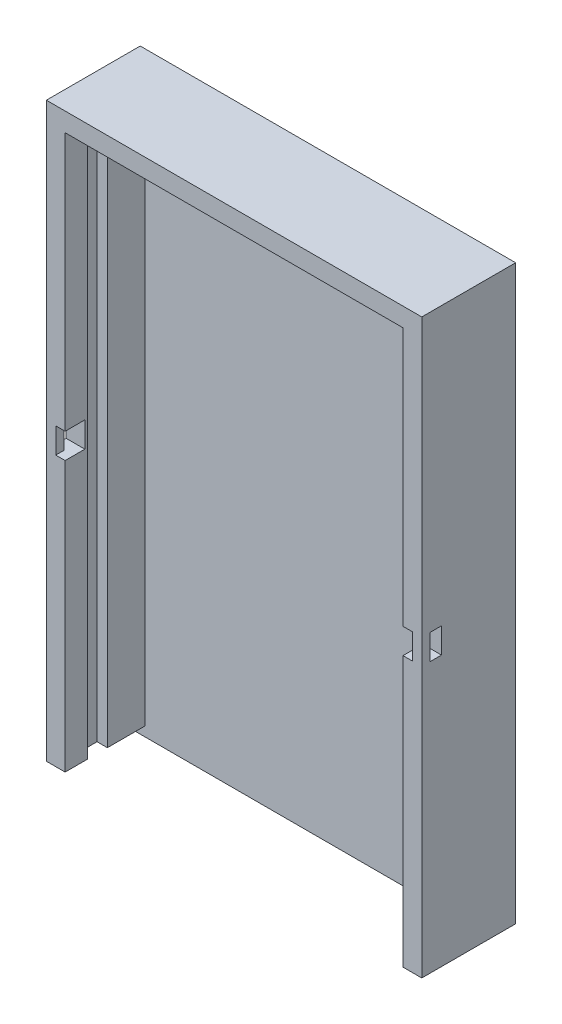
ISO-10303-21;
HEADER;
FILE_DESCRIPTION(('STEP AP214'),'2;1');
FILE_NAME('part.step','',(''),(''),'','','');
FILE_SCHEMA(('AUTOMOTIVE_DESIGN { 1 0 10303 214 1 1 1 1 }'));
ENDSEC;
DATA;
#1=APPLICATION_CONTEXT('core data for automotive mechanical design processes');
#2=APPLICATION_PROTOCOL_DEFINITION('international standard','automotive_design',2000,#1);
#3=PRODUCT_CONTEXT('',#1,'mechanical');
#4=PRODUCT('Part','Part','',(#3));
#5=PRODUCT_RELATED_PRODUCT_CATEGORY('part','',(#4));
#6=PRODUCT_DEFINITION_FORMATION('','',#4);
#7=PRODUCT_DEFINITION_CONTEXT('part definition',#1,'design');
#8=PRODUCT_DEFINITION('design','',#6,#7);
#9=PRODUCT_DEFINITION_SHAPE('','',#8);
#10=(LENGTH_UNIT() NAMED_UNIT(*) SI_UNIT(.MILLI.,.METRE.));
#11=(NAMED_UNIT(*) PLANE_ANGLE_UNIT() SI_UNIT($,.RADIAN.));
#12=(NAMED_UNIT(*) SI_UNIT($,.STERADIAN.) SOLID_ANGLE_UNIT());
#13=UNCERTAINTY_MEASURE_WITH_UNIT(LENGTH_MEASURE(1.E-05),#10,'distance_accuracy_value','');
#14=(GEOMETRIC_REPRESENTATION_CONTEXT(3) GLOBAL_UNCERTAINTY_ASSIGNED_CONTEXT((#13)) GLOBAL_UNIT_ASSIGNED_CONTEXT((#10,
#11,#12)) REPRESENTATION_CONTEXT('',''));
#15=CARTESIAN_POINT('',(0.,0.,0.));
#16=DIRECTION('',(0.,0.,1.));
#17=DIRECTION('',(1.,0.,0.));
#18=AXIS2_PLACEMENT_3D('',#15,#16,#17);
#19=CARTESIAN_POINT('',(-18.,29.,1.5));
#20=DIRECTION('',(-1.,0.,0.));
#21=DIRECTION('',(0.,-1.,0.));
#22=AXIS2_PLACEMENT_3D('',#19,#20,#21);
#23=PLANE('',#22);
#24=DIRECTION('',(0.,-1.,0.));
#25=VECTOR('',#24,1.);
#26=CARTESIAN_POINT('',(-18.,29.,10.));
#27=LINE('',#26,#25);
#28=CARTESIAN_POINT('',(-18.,29.,10.));
#29=VERTEX_POINT('',#28);
#30=CARTESIAN_POINT('',(-18.,1.45,10.));
#31=VERTEX_POINT('',#30);
#32=EDGE_CURVE('E397',#29,#31,#27,.T.);
#33=ORIENTED_EDGE('',*,*,#32,.T.);
#34=DIRECTION('',(0.,0.,-1.));
#35=VECTOR('',#34,1.);
#36=CARTESIAN_POINT('',(-18.,1.45,1.5));
#37=LINE('',#36,#35);
#38=CARTESIAN_POINT('',(-18.,1.45,7.9));
#39=VERTEX_POINT('',#38);
#40=EDGE_CURVE('E268',#31,#39,#37,.T.);
#41=ORIENTED_EDGE('',*,*,#40,.T.);
#42=DIRECTION('',(0.,-1.,0.));
#43=VECTOR('',#42,1.);
#44=CARTESIAN_POINT('',(-18.,29.,7.9));
#45=LINE('',#44,#43);
#46=CARTESIAN_POINT('',(-18.,-1.25,7.9));
#47=VERTEX_POINT('',#46);
#48=EDGE_CURVE('E275',#39,#47,#45,.T.);
#49=ORIENTED_EDGE('',*,*,#48,.T.);
#50=DIRECTION('',(0.,0.,1.));
#51=VECTOR('',#50,1.);
#52=CARTESIAN_POINT('',(-18.,-1.25,1.5));
#53=LINE('',#52,#51);
#54=CARTESIAN_POINT('',(-18.,-1.24999999999999,10.));
#55=VERTEX_POINT('',#54);
#56=EDGE_CURVE('E293',#47,#55,#53,.T.);
#57=ORIENTED_EDGE('',*,*,#56,.T.);
#58=CARTESIAN_POINT('',(-18.,-30.,10.));
#59=VERTEX_POINT('',#58);
#60=EDGE_CURVE('E408',#55,#59,#27,.T.);
#61=ORIENTED_EDGE('',*,*,#60,.T.);
#62=DIRECTION('',(0.,0.,-1.));
#63=VECTOR('',#62,1.);
#64=CARTESIAN_POINT('',(-18.,-30.,1.5));
#65=LINE('',#64,#63);
#66=CARTESIAN_POINT('',(-18.,-30.,7.6));
#67=VERTEX_POINT('',#66);
#68=EDGE_CURVE('E338',#59,#67,#65,.T.);
#69=ORIENTED_EDGE('',*,*,#68,.T.);
#70=DIRECTION('',(0.,1.,0.));
#71=VECTOR('',#70,1.);
#72=CARTESIAN_POINT('',(-18.,29.,7.6));
#73=LINE('',#72,#71);
#74=CARTESIAN_POINT('',(-18.,29.,7.6));
#75=VERTEX_POINT('',#74);
#76=EDGE_CURVE('E390',#67,#75,#73,.T.);
#77=ORIENTED_EDGE('',*,*,#76,.T.);
#78=DIRECTION('',(0.,0.,1.));
#79=VECTOR('',#78,1.);
#80=CARTESIAN_POINT('',(-18.,29.,1.5));
#81=LINE('',#80,#79);
#82=EDGE_CURVE('E417',#75,#29,#81,.T.);
#83=ORIENTED_EDGE('',*,*,#82,.T.);
#84=EDGE_LOOP('',(#33,#41,#49,#57,#61,#69,#77,#83));
#85=FACE_BOUND('',#84,.T.);
#86=ADVANCED_FACE('F39',(#85),#23,.F.);
#87=CARTESIAN_POINT('',(20.,1.45,9.1));
#88=DIRECTION('',(0.,0.,1.));
#89=DIRECTION('',(1.,0.,0.));
#90=AXIS2_PLACEMENT_3D('',#87,#88,#89);
#91=PLANE('',#90);
#92=DIRECTION('',(0.,1.,0.));
#93=VECTOR('',#92,1.);
#94=CARTESIAN_POINT('',(-19.,1.45,9.1));
#95=LINE('',#94,#93);
#96=CARTESIAN_POINT('',(-19.,-1.24999999999999,9.1));
#97=VERTEX_POINT('',#96);
#98=CARTESIAN_POINT('',(-19.,1.45,9.1));
#99=VERTEX_POINT('',#98);
#100=EDGE_CURVE('E500',#97,#99,#95,.T.);
#101=ORIENTED_EDGE('',*,*,#100,.F.);
#102=DIRECTION('',(-1.,0.,0.));
#103=VECTOR('',#102,1.);
#104=CARTESIAN_POINT('',(20.,-1.25,9.1));
#105=LINE('',#104,#103);
#106=CARTESIAN_POINT('',(-20.,-1.25,9.1));
#107=VERTEX_POINT('',#106);
#108=EDGE_CURVE('E269',#97,#107,#105,.T.);
#109=ORIENTED_EDGE('',*,*,#108,.T.);
#110=DIRECTION('',(0.,1.,0.));
#111=VECTOR('',#110,1.);
#112=CARTESIAN_POINT('',(-20.,1.45,9.1));
#113=LINE('',#112,#111);
#114=CARTESIAN_POINT('',(-20.,1.45,9.1));
#115=VERTEX_POINT('',#114);
#116=EDGE_CURVE('E468',#107,#115,#113,.T.);
#117=ORIENTED_EDGE('',*,*,#116,.T.);
#118=DIRECTION('',(-1.,0.,0.));
#119=VECTOR('',#118,1.);
#120=CARTESIAN_POINT('',(20.,1.45,9.1));
#121=LINE('',#120,#119);
#122=EDGE_CURVE('E290',#99,#115,#121,.T.);
#123=ORIENTED_EDGE('',*,*,#122,.F.);
#124=EDGE_LOOP('',(#101,#109,#117,#123));
#125=FACE_BOUND('',#124,.T.);
#126=ADVANCED_FACE('F532',(#125),#91,.F.);
#127=CARTESIAN_POINT('',(0.,-30.,0.));
#128=DIRECTION('',(0.,1.,0.));
#129=DIRECTION('',(0.,0.,1.));
#130=AXIS2_PLACEMENT_3D('',#127,#128,#129);
#131=PLANE('',#130);
#132=DIRECTION('',(0.,0.,-1.));
#133=VECTOR('',#132,1.);
#134=CARTESIAN_POINT('',(-19.4,-30.,0.));
#135=LINE('',#134,#133);
#136=CARTESIAN_POINT('',(-19.4,-30.,1.5));
#137=VERTEX_POINT('',#136);
#138=CARTESIAN_POINT('',(-19.4,-30.,0.));
#139=VERTEX_POINT('',#138);
#140=EDGE_CURVE('E291',#137,#139,#135,.T.);
#141=ORIENTED_EDGE('',*,*,#140,.F.);
#142=DIRECTION('',(-1.,0.,0.));
#143=VECTOR('',#142,1.);
#144=CARTESIAN_POINT('',(-19.4,-30.,1.5));
#145=LINE('',#144,#143);
#146=CARTESIAN_POINT('',(-18.,-30.,1.5));
#147=VERTEX_POINT('',#146);
#148=EDGE_CURVE('E315',#147,#137,#145,.T.);
#149=ORIENTED_EDGE('',*,*,#148,.F.);
#150=DIRECTION('',(0.,0.,-1.));
#151=VECTOR('',#150,1.);
#152=CARTESIAN_POINT('',(-18.,-30.,1.5));
#153=LINE('',#152,#151);
#154=CARTESIAN_POINT('',(-18.,-30.,5.5));
#155=VERTEX_POINT('',#154);
#156=EDGE_CURVE('E342',#155,#147,#153,.T.);
#157=ORIENTED_EDGE('',*,*,#156,.F.);
#158=DIRECTION('',(1.,0.,0.));
#159=VECTOR('',#158,1.);
#160=CARTESIAN_POINT('',(-19.1,-30.,5.5));
#161=LINE('',#160,#159);
#162=CARTESIAN_POINT('',(-19.1,-30.,5.5));
#163=VERTEX_POINT('',#162);
#164=EDGE_CURVE('E340',#163,#155,#161,.T.);
#165=ORIENTED_EDGE('',*,*,#164,.F.);
#166=DIRECTION('',(0.,0.,-1.));
#167=VECTOR('',#166,1.);
#168=CARTESIAN_POINT('',(-19.1,-30.,7.6));
#169=LINE('',#168,#167);
#170=CARTESIAN_POINT('',(-19.1,-30.,7.6));
#171=VERTEX_POINT('',#170);
#172=EDGE_CURVE('E447',#171,#163,#169,.T.);
#173=ORIENTED_EDGE('',*,*,#172,.F.);
#174=DIRECTION('',(-1.,0.,0.));
#175=VECTOR('',#174,1.);
#176=CARTESIAN_POINT('',(-19.1,-30.,7.6));
#177=LINE('',#176,#175);
#178=EDGE_CURVE('E334',#67,#171,#177,.T.);
#179=ORIENTED_EDGE('',*,*,#178,.F.);
#180=ORIENTED_EDGE('',*,*,#68,.F.);
#181=DIRECTION('',(-1.,0.,0.));
#182=VECTOR('',#181,1.);
#183=CARTESIAN_POINT('',(-20.,-30.,10.));
#184=LINE('',#183,#182);
#185=CARTESIAN_POINT('',(-20.,-30.,10.));
#186=VERTEX_POINT('',#185);
#187=EDGE_CURVE('E332',#59,#186,#184,.T.);
#188=ORIENTED_EDGE('',*,*,#187,.T.);
#189=DIRECTION('',(0.,0.,-1.));
#190=VECTOR('',#189,1.);
#191=CARTESIAN_POINT('',(-20.,-30.,0.));
#192=LINE('',#191,#190);
#193=CARTESIAN_POINT('',(-20.,-30.,0.));
#194=VERTEX_POINT('',#193);
#195=EDGE_CURVE('E323',#186,#194,#192,.T.);
#196=ORIENTED_EDGE('',*,*,#195,.T.);
#197=DIRECTION('',(1.,0.,0.));
#198=VECTOR('',#197,1.);
#199=CARTESIAN_POINT('',(-20.,-30.,0.));
#200=LINE('',#199,#198);
#201=EDGE_CURVE('E330',#194,#139,#200,.T.);
#202=ORIENTED_EDGE('',*,*,#201,.T.);
#203=EDGE_LOOP('',(#141,#149,#157,#165,#173,#179,#180,#188,#196,#202));
#204=FACE_BOUND('',#203,.T.);
#205=ADVANCED_FACE('F538',(#204),#131,.F.);
#206=CARTESIAN_POINT('',(19.,-30.,1.5));
#207=VERTEX_POINT('',#206);
#208=CARTESIAN_POINT('',(18.,-30.,1.5));
#209=VERTEX_POINT('',#208);
#210=EDGE_CURVE('E296',#207,#209,#145,.T.);
#211=ORIENTED_EDGE('',*,*,#210,.F.);
#212=DIRECTION('',(0.,0.,1.));
#213=VECTOR('',#212,1.);
#214=CARTESIAN_POINT('',(19.,-30.,0.));
#215=LINE('',#214,#213);
#216=CARTESIAN_POINT('',(19.,-30.,0.));
#217=VERTEX_POINT('',#216);
#218=EDGE_CURVE('E310',#217,#207,#215,.T.);
#219=ORIENTED_EDGE('',*,*,#218,.F.);
#220=CARTESIAN_POINT('',(20.,-30.,0.));
#221=VERTEX_POINT('',#220);
#222=EDGE_CURVE('E328',#217,#221,#200,.T.);
#223=ORIENTED_EDGE('',*,*,#222,.T.);
#224=DIRECTION('',(0.,0.,1.));
#225=VECTOR('',#224,1.);
#226=CARTESIAN_POINT('',(20.,-30.,0.));
#227=LINE('',#226,#225);
#228=CARTESIAN_POINT('',(20.,-30.,10.));
#229=VERTEX_POINT('',#228);
#230=EDGE_CURVE('E329',#221,#229,#227,.T.);
#231=ORIENTED_EDGE('',*,*,#230,.T.);
#232=CARTESIAN_POINT('',(18.,-30.,10.));
#233=VERTEX_POINT('',#232);
#234=EDGE_CURVE('E335',#229,#233,#184,.T.);
#235=ORIENTED_EDGE('',*,*,#234,.T.);
#236=DIRECTION('',(0.,0.,1.));
#237=VECTOR('',#236,1.);
#238=CARTESIAN_POINT('',(18.,-30.,1.5));
#239=LINE('',#238,#237);
#240=CARTESIAN_POINT('',(18.,-30.,7.6));
#241=VERTEX_POINT('',#240);
#242=EDGE_CURVE('E356',#241,#233,#239,.T.);
#243=ORIENTED_EDGE('',*,*,#242,.F.);
#244=DIRECTION('',(-1.,0.,0.));
#245=VECTOR('',#244,1.);
#246=CARTESIAN_POINT('',(-19.1,-30.,7.6));
#247=LINE('',#246,#245);
#248=CARTESIAN_POINT('',(19.1,-30.,7.6));
#249=VERTEX_POINT('',#248);
#250=EDGE_CURVE('E351',#249,#241,#247,.T.);
#251=ORIENTED_EDGE('',*,*,#250,.F.);
#252=DIRECTION('',(0.,0.,1.));
#253=VECTOR('',#252,1.);
#254=CARTESIAN_POINT('',(19.1,-30.,7.6));
#255=LINE('',#254,#253);
#256=CARTESIAN_POINT('',(19.1,-30.,5.5));
#257=VERTEX_POINT('',#256);
#258=EDGE_CURVE('E355',#257,#249,#255,.T.);
#259=ORIENTED_EDGE('',*,*,#258,.F.);
#260=DIRECTION('',(1.,0.,0.));
#261=VECTOR('',#260,1.);
#262=CARTESIAN_POINT('',(-19.1,-30.,5.5));
#263=LINE('',#262,#261);
#264=CARTESIAN_POINT('',(18.,-30.,5.5));
#265=VERTEX_POINT('',#264);
#266=EDGE_CURVE('E349',#265,#257,#263,.T.);
#267=ORIENTED_EDGE('',*,*,#266,.F.);
#268=DIRECTION('',(0.,0.,1.));
#269=VECTOR('',#268,1.);
#270=CARTESIAN_POINT('',(18.,-30.,1.5));
#271=LINE('',#270,#269);
#272=EDGE_CURVE('E348',#209,#265,#271,.T.);
#273=ORIENTED_EDGE('',*,*,#272,.F.);
#274=EDGE_LOOP('',(#211,#219,#223,#231,#235,#243,#251,#259,#267,#273));
#275=FACE_BOUND('',#274,.T.);
#276=ADVANCED_FACE('F615',(#275),#131,.F.);
#277=CARTESIAN_POINT('',(-20.,31.,10.));
#278=DIRECTION('',(1.,0.,0.));
#279=DIRECTION('',(0.,1.,0.));
#280=AXIS2_PLACEMENT_3D('',#277,#278,#279);
#281=PLANE('',#280);
#282=DIRECTION('',(0.,0.,-1.));
#283=VECTOR('',#282,1.);
#284=CARTESIAN_POINT('',(-20.,1.45,9.1));
#285=LINE('',#284,#283);
#286=CARTESIAN_POINT('',(-20.,1.45,7.9));
#287=VERTEX_POINT('',#286);
#288=EDGE_CURVE('E472',#115,#287,#285,.T.);
#289=ORIENTED_EDGE('',*,*,#288,.F.);
#290=ORIENTED_EDGE('',*,*,#116,.F.);
#291=DIRECTION('',(0.,0.,1.));
#292=VECTOR('',#291,1.);
#293=CARTESIAN_POINT('',(-20.,-1.25,9.1));
#294=LINE('',#293,#292);
#295=CARTESIAN_POINT('',(-20.,-1.25,7.9));
#296=VERTEX_POINT('',#295);
#297=EDGE_CURVE('E280',#296,#107,#294,.T.);
#298=ORIENTED_EDGE('',*,*,#297,.F.);
#299=DIRECTION('',(0.,-1.,0.));
#300=VECTOR('',#299,1.);
#301=CARTESIAN_POINT('',(-20.,1.45,7.9));
#302=LINE('',#301,#300);
#303=EDGE_CURVE('E478',#287,#296,#302,.T.);
#304=ORIENTED_EDGE('',*,*,#303,.F.);
#305=EDGE_LOOP('',(#289,#290,#298,#304));
#306=FACE_BOUND('',#305,.T.);
#307=ORIENTED_EDGE('',*,*,#195,.F.);
#308=DIRECTION('',(0.,-1.,0.));
#309=VECTOR('',#308,1.);
#310=CARTESIAN_POINT('',(-20.,31.,10.));
#311=LINE('',#310,#309);
#312=CARTESIAN_POINT('',(-20.,31.,10.));
#313=VERTEX_POINT('',#312);
#314=EDGE_CURVE('E430',#313,#186,#311,.T.);
#315=ORIENTED_EDGE('',*,*,#314,.F.);
#316=DIRECTION('',(0.,0.,-1.));
#317=VECTOR('',#316,1.);
#318=CARTESIAN_POINT('',(-20.,31.,10.));
#319=LINE('',#318,#317);
#320=CARTESIAN_POINT('',(-20.,31.,0.));
#321=VERTEX_POINT('',#320);
#322=EDGE_CURVE('E427',#313,#321,#319,.T.);
#323=ORIENTED_EDGE('',*,*,#322,.T.);
#324=DIRECTION('',(0.,-1.,0.));
#325=VECTOR('',#324,1.);
#326=CARTESIAN_POINT('',(-20.,31.,0.));
#327=LINE('',#326,#325);
#328=EDGE_CURVE('E425',#321,#194,#327,.T.);
#329=ORIENTED_EDGE('',*,*,#328,.T.);
#330=EDGE_LOOP('',(#307,#315,#323,#329));
#331=FACE_BOUND('',#330,.T.);
#332=ADVANCED_FACE('F551',(#306,#331),#281,.F.);
#333=CARTESIAN_POINT('',(0.,0.,10.));
#334=DIRECTION('',(0.,0.,-1.));
#335=DIRECTION('',(-1.,0.,0.));
#336=AXIS2_PLACEMENT_3D('',#333,#334,#335);
#337=PLANE('',#336);
#338=DIRECTION('',(0.,-1.,0.));
#339=VECTOR('',#338,1.);
#340=CARTESIAN_POINT('',(19.,1.45,10.));
#341=LINE('',#340,#339);
#342=CARTESIAN_POINT('',(19.,1.45,10.));
#343=VERTEX_POINT('',#342);
#344=CARTESIAN_POINT('',(19.,-1.24999999999999,10.));
#345=VERTEX_POINT('',#344);
#346=EDGE_CURVE('E253',#343,#345,#341,.T.);
#347=ORIENTED_EDGE('',*,*,#346,.T.);
#348=DIRECTION('',(-1.,0.,0.));
#349=VECTOR('',#348,1.);
#350=CARTESIAN_POINT('',(19.,-1.24999999999999,10.));
#351=LINE('',#350,#349);
#352=CARTESIAN_POINT('',(18.,-1.24999999999999,10.));
#353=VERTEX_POINT('',#352);
#354=EDGE_CURVE('E254',#345,#353,#351,.T.);
#355=ORIENTED_EDGE('',*,*,#354,.T.);
#356=DIRECTION('',(0.,1.,0.));
#357=VECTOR('',#356,1.);
#358=CARTESIAN_POINT('',(18.,-29.,10.));
#359=LINE('',#358,#357);
#360=EDGE_CURVE('E401',#233,#353,#359,.T.);
#361=ORIENTED_EDGE('',*,*,#360,.F.);
#362=ORIENTED_EDGE('',*,*,#234,.F.);
#363=DIRECTION('',(0.,-1.,0.));
#364=VECTOR('',#363,1.);
#365=CARTESIAN_POINT('',(20.,31.,10.));
#366=LINE('',#365,#364);
#367=CARTESIAN_POINT('',(20.,31.,10.));
#368=VERTEX_POINT('',#367);
#369=EDGE_CURVE('E416',#368,#229,#366,.T.);
#370=ORIENTED_EDGE('',*,*,#369,.F.);
#371=DIRECTION('',(1.,0.,0.));
#372=VECTOR('',#371,1.);
#373=CARTESIAN_POINT('',(-20.,31.,10.));
#374=LINE('',#373,#372);
#375=EDGE_CURVE('E421',#313,#368,#374,.T.);
#376=ORIENTED_EDGE('',*,*,#375,.F.);
#377=ORIENTED_EDGE('',*,*,#314,.T.);
#378=ORIENTED_EDGE('',*,*,#187,.F.);
#379=ORIENTED_EDGE('',*,*,#60,.F.);
#380=DIRECTION('',(1.,0.,0.));
#381=VECTOR('',#380,1.);
#382=CARTESIAN_POINT('',(-19.,-1.24999999999999,10.));
#383=LINE('',#382,#381);
#384=CARTESIAN_POINT('',(-19.,-1.24999999999999,10.));
#385=VERTEX_POINT('',#384);
#386=EDGE_CURVE('E473',#385,#55,#383,.T.);
#387=ORIENTED_EDGE('',*,*,#386,.F.);
#388=DIRECTION('',(0.,-1.,0.));
#389=VECTOR('',#388,1.);
#390=CARTESIAN_POINT('',(-19.,1.45,10.));
#391=LINE('',#390,#389);
#392=CARTESIAN_POINT('',(-19.,1.45,10.));
#393=VERTEX_POINT('',#392);
#394=EDGE_CURVE('E494',#393,#385,#391,.T.);
#395=ORIENTED_EDGE('',*,*,#394,.F.);
#396=DIRECTION('',(1.,0.,0.));
#397=VECTOR('',#396,1.);
#398=CARTESIAN_POINT('',(-19.,1.45,10.));
#399=LINE('',#398,#397);
#400=EDGE_CURVE('E487',#393,#31,#399,.T.);
#401=ORIENTED_EDGE('',*,*,#400,.T.);
#402=ORIENTED_EDGE('',*,*,#32,.F.);
#403=DIRECTION('',(-1.,0.,0.));
#404=VECTOR('',#403,1.);
#405=CARTESIAN_POINT('',(18.,29.,10.));
#406=LINE('',#405,#404);
#407=CARTESIAN_POINT('',(18.,29.,10.));
#408=VERTEX_POINT('',#407);
#409=EDGE_CURVE('E406',#408,#29,#406,.T.);
#410=ORIENTED_EDGE('',*,*,#409,.F.);
#411=CARTESIAN_POINT('',(18.,1.45,10.));
#412=VERTEX_POINT('',#411);
#413=EDGE_CURVE('E395',#412,#408,#359,.T.);
#414=ORIENTED_EDGE('',*,*,#413,.F.);
#415=DIRECTION('',(-1.,0.,0.));
#416=VECTOR('',#415,1.);
#417=CARTESIAN_POINT('',(19.,1.45,10.));
#418=LINE('',#417,#416);
#419=EDGE_CURVE('E497',#343,#412,#418,.T.);
#420=ORIENTED_EDGE('',*,*,#419,.F.);
#421=EDGE_LOOP('',(#347,#355,#361,#362,#370,#376,#377,#378,#379,#387,#395,#401,#402,#410,#414,#420));
#422=FACE_BOUND('',#421,.T.);
#423=ADVANCED_FACE('F504',(#422),#337,.F.);
#424=DIRECTION('',(0.,-1.,0.));
#425=VECTOR('',#424,1.);
#426=CARTESIAN_POINT('',(-18.,29.,5.5));
#427=LINE('',#426,#425);
#428=CARTESIAN_POINT('',(-18.,29.,5.5));
#429=VERTEX_POINT('',#428);
#430=EDGE_CURVE('E388',#429,#155,#427,.T.);
#431=ORIENTED_EDGE('',*,*,#430,.T.);
#432=ORIENTED_EDGE('',*,*,#156,.T.);
#433=DIRECTION('',(0.,-1.,0.));
#434=VECTOR('',#433,1.);
#435=CARTESIAN_POINT('',(-18.,29.,1.5));
#436=LINE('',#435,#434);
#437=CARTESIAN_POINT('',(-18.,29.,1.5));
#438=VERTEX_POINT('',#437);
#439=EDGE_CURVE('E399',#438,#147,#436,.T.);
#440=ORIENTED_EDGE('',*,*,#439,.F.);
#441=EDGE_CURVE('E415',#438,#429,#81,.T.);
#442=ORIENTED_EDGE('',*,*,#441,.T.);
#443=EDGE_LOOP('',(#431,#432,#440,#442));
#444=FACE_BOUND('',#443,.T.);
#445=ADVANCED_FACE('F534',(#444),#23,.F.);
#446=CARTESIAN_POINT('',(18.,-29.,1.5));
#447=DIRECTION('',(1.,0.,0.));
#448=DIRECTION('',(0.,1.,0.));
#449=AXIS2_PLACEMENT_3D('',#446,#447,#448);
#450=PLANE('',#449);
#451=DIRECTION('',(0.,1.,0.));
#452=VECTOR('',#451,1.);
#453=CARTESIAN_POINT('',(18.,-29.,1.5));
#454=LINE('',#453,#452);
#455=CARTESIAN_POINT('',(18.,29.,1.5));
#456=VERTEX_POINT('',#455);
#457=EDGE_CURVE('E391',#209,#456,#454,.T.);
#458=ORIENTED_EDGE('',*,*,#457,.F.);
#459=ORIENTED_EDGE('',*,*,#272,.T.);
#460=DIRECTION('',(0.,1.,0.));
#461=VECTOR('',#460,1.);
#462=CARTESIAN_POINT('',(18.,-29.,5.5));
#463=LINE('',#462,#461);
#464=CARTESIAN_POINT('',(18.,29.,5.5));
#465=VERTEX_POINT('',#464);
#466=EDGE_CURVE('E443',#265,#465,#463,.T.);
#467=ORIENTED_EDGE('',*,*,#466,.T.);
#468=DIRECTION('',(0.,0.,1.));
#469=VECTOR('',#468,1.);
#470=CARTESIAN_POINT('',(18.,29.,1.5));
#471=LINE('',#470,#469);
#472=EDGE_CURVE('E420',#456,#465,#471,.T.);
#473=ORIENTED_EDGE('',*,*,#472,.F.);
#474=EDGE_LOOP('',(#458,#459,#467,#473));
#475=FACE_BOUND('',#474,.T.);
#476=ADVANCED_FACE('F544',(#475),#450,.F.);
#477=CARTESIAN_POINT('',(20.,31.,10.));
#478=DIRECTION('',(1.,0.,0.));
#479=DIRECTION('',(0.,1.,0.));
#480=AXIS2_PLACEMENT_3D('',#477,#478,#479);
#481=PLANE('',#480);
#482=DIRECTION('',(0.,1.,0.));
#483=VECTOR('',#482,1.);
#484=CARTESIAN_POINT('',(20.,1.45,9.1));
#485=LINE('',#484,#483);
#486=CARTESIAN_POINT('',(20.,-1.25,9.1));
#487=VERTEX_POINT('',#486);
#488=CARTESIAN_POINT('',(20.,1.45,9.1));
#489=VERTEX_POINT('',#488);
#490=EDGE_CURVE('E267',#487,#489,#485,.T.);
#491=ORIENTED_EDGE('',*,*,#490,.T.);
#492=DIRECTION('',(0.,0.,-1.));
#493=VECTOR('',#492,1.);
#494=CARTESIAN_POINT('',(20.,1.45,9.1));
#495=LINE('',#494,#493);
#496=CARTESIAN_POINT('',(20.,1.45,7.9));
#497=VERTEX_POINT('',#496);
#498=EDGE_CURVE('E461',#489,#497,#495,.T.);
#499=ORIENTED_EDGE('',*,*,#498,.T.);
#500=DIRECTION('',(0.,-1.,0.));
#501=VECTOR('',#500,1.);
#502=CARTESIAN_POINT('',(20.,1.45,7.9));
#503=LINE('',#502,#501);
#504=CARTESIAN_POINT('',(20.,-1.25,7.9));
#505=VERTEX_POINT('',#504);
#506=EDGE_CURVE('E457',#497,#505,#503,.T.);
#507=ORIENTED_EDGE('',*,*,#506,.T.);
#508=DIRECTION('',(0.,0.,1.));
#509=VECTOR('',#508,1.);
#510=CARTESIAN_POINT('',(20.,-1.25,9.1));
#511=LINE('',#510,#509);
#512=EDGE_CURVE('E460',#505,#487,#511,.T.);
#513=ORIENTED_EDGE('',*,*,#512,.T.);
#514=EDGE_LOOP('',(#491,#499,#507,#513));
#515=FACE_BOUND('',#514,.T.);
#516=ORIENTED_EDGE('',*,*,#230,.F.);
#517=DIRECTION('',(0.,-1.,0.));
#518=VECTOR('',#517,1.);
#519=CARTESIAN_POINT('',(20.,31.,0.));
#520=LINE('',#519,#518);
#521=CARTESIAN_POINT('',(20.,31.,0.));
#522=VERTEX_POINT('',#521);
#523=EDGE_CURVE('E412',#522,#221,#520,.T.);
#524=ORIENTED_EDGE('',*,*,#523,.F.);
#525=DIRECTION('',(0.,0.,-1.));
#526=VECTOR('',#525,1.);
#527=CARTESIAN_POINT('',(20.,31.,10.));
#528=LINE('',#527,#526);
#529=EDGE_CURVE('E437',#368,#522,#528,.T.);
#530=ORIENTED_EDGE('',*,*,#529,.F.);
#531=ORIENTED_EDGE('',*,*,#369,.T.);
#532=EDGE_LOOP('',(#516,#524,#530,#531));
#533=FACE_BOUND('',#532,.T.);
#534=ADVANCED_FACE('F41',(#515,#533),#481,.T.);
#535=CARTESIAN_POINT('',(-20.,31.,10.));
#536=DIRECTION('',(0.,1.,0.));
#537=DIRECTION('',(0.,0.,1.));
#538=AXIS2_PLACEMENT_3D('',#535,#536,#537);
#539=PLANE('',#538);
#540=DIRECTION('',(1.,0.,0.));
#541=VECTOR('',#540,1.);
#542=CARTESIAN_POINT('',(-20.,31.,0.));
#543=LINE('',#542,#541);
#544=EDGE_CURVE('E433',#321,#522,#543,.T.);
#545=ORIENTED_EDGE('',*,*,#544,.F.);
#546=ORIENTED_EDGE('',*,*,#322,.F.);
#547=ORIENTED_EDGE('',*,*,#375,.T.);
#548=ORIENTED_EDGE('',*,*,#529,.T.);
#549=EDGE_LOOP('',(#545,#546,#547,#548));
#550=FACE_BOUND('',#549,.T.);
#551=ADVANCED_FACE('F617',(#550),#539,.T.);
#552=CARTESIAN_POINT('',(0.,0.,0.));
#553=DIRECTION('',(0.,0.,-1.));
#554=DIRECTION('',(-1.,0.,0.));
#555=AXIS2_PLACEMENT_3D('',#552,#553,#554);
#556=PLANE('',#555);
#557=ORIENTED_EDGE('',*,*,#201,.F.);
#558=ORIENTED_EDGE('',*,*,#328,.F.);
#559=ORIENTED_EDGE('',*,*,#544,.T.);
#560=ORIENTED_EDGE('',*,*,#523,.T.);
#561=ORIENTED_EDGE('',*,*,#222,.F.);
#562=DIRECTION('',(0.,1.,0.));
#563=VECTOR('',#562,1.);
#564=CARTESIAN_POINT('',(19.,-31.,0.));
#565=LINE('',#564,#563);
#566=CARTESIAN_POINT('',(19.,-31.,0.));
#567=VERTEX_POINT('',#566);
#568=EDGE_CURVE('E319',#567,#217,#565,.T.);
#569=ORIENTED_EDGE('',*,*,#568,.F.);
#570=DIRECTION('',(1.,0.,0.));
#571=VECTOR('',#570,1.);
#572=CARTESIAN_POINT('',(-19.4,-31.,0.));
#573=LINE('',#572,#571);
#574=CARTESIAN_POINT('',(-19.4,-31.,0.));
#575=VERTEX_POINT('',#574);
#576=EDGE_CURVE('E300',#575,#567,#573,.T.);
#577=ORIENTED_EDGE('',*,*,#576,.F.);
#578=DIRECTION('',(0.,1.,0.));
#579=VECTOR('',#578,1.);
#580=CARTESIAN_POINT('',(-19.4,-31.,0.));
#581=LINE('',#580,#579);
#582=EDGE_CURVE('E321',#575,#139,#581,.T.);
#583=ORIENTED_EDGE('',*,*,#582,.T.);
#584=EDGE_LOOP('',(#557,#558,#559,#560,#561,#569,#577,#583));
#585=FACE_BOUND('',#584,.T.);
#586=ADVANCED_FACE('F583',(#585),#556,.T.);
#587=CARTESIAN_POINT('',(18.,29.,1.5));
#588=DIRECTION('',(0.,1.,0.));
#589=DIRECTION('',(0.,0.,1.));
#590=AXIS2_PLACEMENT_3D('',#587,#588,#589);
#591=PLANE('',#590);
#592=ORIENTED_EDGE('',*,*,#472,.T.);
#593=DIRECTION('',(1.,0.,0.));
#594=VECTOR('',#593,1.);
#595=CARTESIAN_POINT('',(-19.1,29.,5.5));
#596=LINE('',#595,#594);
#597=CARTESIAN_POINT('',(19.1,29.,5.5));
#598=VERTEX_POINT('',#597);
#599=EDGE_CURVE('E363',#465,#598,#596,.T.);
#600=ORIENTED_EDGE('',*,*,#599,.T.);
#601=DIRECTION('',(0.,0.,1.));
#602=VECTOR('',#601,1.);
#603=CARTESIAN_POINT('',(19.1,29.,7.6));
#604=LINE('',#603,#602);
#605=CARTESIAN_POINT('',(19.1,29.,7.6));
#606=VERTEX_POINT('',#605);
#607=EDGE_CURVE('E374',#598,#606,#604,.T.);
#608=ORIENTED_EDGE('',*,*,#607,.T.);
#609=DIRECTION('',(-1.,0.,0.));
#610=VECTOR('',#609,1.);
#611=CARTESIAN_POINT('',(-19.1,29.,7.6));
#612=LINE('',#611,#610);
#613=CARTESIAN_POINT('',(18.,29.,7.6));
#614=VERTEX_POINT('',#613);
#615=EDGE_CURVE('E371',#606,#614,#612,.T.);
#616=ORIENTED_EDGE('',*,*,#615,.T.);
#617=EDGE_CURVE('E405',#614,#408,#471,.T.);
#618=ORIENTED_EDGE('',*,*,#617,.T.);
#619=ORIENTED_EDGE('',*,*,#409,.T.);
#620=ORIENTED_EDGE('',*,*,#82,.F.);
#621=CARTESIAN_POINT('',(-19.1,29.,7.6));
#622=VERTEX_POINT('',#621);
#623=EDGE_CURVE('E372',#75,#622,#612,.T.);
#624=ORIENTED_EDGE('',*,*,#623,.T.);
#625=DIRECTION('',(0.,0.,-1.));
#626=VECTOR('',#625,1.);
#627=CARTESIAN_POINT('',(-19.1,29.,7.6));
#628=LINE('',#627,#626);
#629=CARTESIAN_POINT('',(-19.1,29.,5.5));
#630=VERTEX_POINT('',#629);
#631=EDGE_CURVE('E366',#622,#630,#628,.T.);
#632=ORIENTED_EDGE('',*,*,#631,.T.);
#633=EDGE_CURVE('E365',#630,#429,#596,.T.);
#634=ORIENTED_EDGE('',*,*,#633,.T.);
#635=ORIENTED_EDGE('',*,*,#441,.F.);
#636=DIRECTION('',(-1.,0.,0.));
#637=VECTOR('',#636,1.);
#638=CARTESIAN_POINT('',(18.,29.,1.5));
#639=LINE('',#638,#637);
#640=EDGE_CURVE('E392',#456,#438,#639,.T.);
#641=ORIENTED_EDGE('',*,*,#640,.F.);
#642=EDGE_LOOP('',(#592,#600,#608,#616,#618,#619,#620,#624,#632,#634,#635,#641));
#643=FACE_BOUND('',#642,.T.);
#644=ADVANCED_FACE('F559',(#643),#591,.F.);
#645=ORIENTED_EDGE('',*,*,#360,.T.);
#646=DIRECTION('',(0.,0.,-1.));
#647=VECTOR('',#646,1.);
#648=CARTESIAN_POINT('',(18.,-1.25,1.5));
#649=LINE('',#648,#647);
#650=CARTESIAN_POINT('',(18.,-1.25,7.9));
#651=VERTEX_POINT('',#650);
#652=EDGE_CURVE('E11',#353,#651,#649,.T.);
#653=ORIENTED_EDGE('',*,*,#652,.T.);
#654=DIRECTION('',(0.,1.,0.));
#655=VECTOR('',#654,1.);
#656=CARTESIAN_POINT('',(18.,-29.,7.9));
#657=LINE('',#656,#655);
#658=CARTESIAN_POINT('',(18.,1.45,7.9));
#659=VERTEX_POINT('',#658);
#660=EDGE_CURVE('E50',#651,#659,#657,.T.);
#661=ORIENTED_EDGE('',*,*,#660,.T.);
#662=DIRECTION('',(0.,0.,1.));
#663=VECTOR('',#662,1.);
#664=CARTESIAN_POINT('',(18.,1.45,1.49999999999999));
#665=LINE('',#664,#663);
#666=EDGE_CURVE('E446',#659,#412,#665,.T.);
#667=ORIENTED_EDGE('',*,*,#666,.T.);
#668=ORIENTED_EDGE('',*,*,#413,.T.);
#669=ORIENTED_EDGE('',*,*,#617,.F.);
#670=DIRECTION('',(0.,-1.,0.));
#671=VECTOR('',#670,1.);
#672=CARTESIAN_POINT('',(18.,-29.,7.6));
#673=LINE('',#672,#671);
#674=EDGE_CURVE('E441',#614,#241,#673,.T.);
#675=ORIENTED_EDGE('',*,*,#674,.T.);
#676=ORIENTED_EDGE('',*,*,#242,.T.);
#677=EDGE_LOOP('',(#645,#653,#661,#667,#668,#669,#675,#676));
#678=FACE_BOUND('',#677,.T.);
#679=ADVANCED_FACE('F455',(#678),#450,.F.);
#680=CARTESIAN_POINT('',(0.,0.,1.5));
#681=DIRECTION('',(0.,0.,1.));
#682=DIRECTION('',(1.,0.,0.));
#683=AXIS2_PLACEMENT_3D('',#680,#681,#682);
#684=PLANE('',#683);
#685=ORIENTED_EDGE('',*,*,#439,.T.);
#686=ORIENTED_EDGE('',*,*,#148,.T.);
#687=DIRECTION('',(0.,1.,0.));
#688=VECTOR('',#687,1.);
#689=CARTESIAN_POINT('',(-19.4,-31.,1.5));
#690=LINE('',#689,#688);
#691=CARTESIAN_POINT('',(-19.4,-31.,1.5));
#692=VERTEX_POINT('',#691);
#693=EDGE_CURVE('E302',#692,#137,#690,.T.);
#694=ORIENTED_EDGE('',*,*,#693,.F.);
#695=DIRECTION('',(-1.,0.,0.));
#696=VECTOR('',#695,1.);
#697=CARTESIAN_POINT('',(-19.4,-31.,1.5));
#698=LINE('',#697,#696);
#699=CARTESIAN_POINT('',(19.,-31.,1.5));
#700=VERTEX_POINT('',#699);
#701=EDGE_CURVE('E305',#700,#692,#698,.T.);
#702=ORIENTED_EDGE('',*,*,#701,.F.);
#703=DIRECTION('',(0.,1.,0.));
#704=VECTOR('',#703,1.);
#705=CARTESIAN_POINT('',(19.,-31.,1.5));
#706=LINE('',#705,#704);
#707=EDGE_CURVE('E314',#700,#207,#706,.T.);
#708=ORIENTED_EDGE('',*,*,#707,.T.);
#709=ORIENTED_EDGE('',*,*,#210,.T.);
#710=ORIENTED_EDGE('',*,*,#457,.T.);
#711=ORIENTED_EDGE('',*,*,#640,.T.);
#712=EDGE_LOOP('',(#685,#686,#694,#702,#708,#709,#710,#711));
#713=FACE_BOUND('',#712,.T.);
#714=ADVANCED_FACE('F594',(#713),#684,.T.);
#715=CARTESIAN_POINT('',(-19.1,67.2576789677576,7.6));
#716=DIRECTION('',(0.,0.,1.));
#717=DIRECTION('',(1.,0.,0.));
#718=AXIS2_PLACEMENT_3D('',#715,#716,#717);
#719=PLANE('',#718);
#720=DIRECTION('',(0.,-1.,0.));
#721=VECTOR('',#720,1.);
#722=CARTESIAN_POINT('',(19.1,67.2576789677576,7.6));
#723=LINE('',#722,#721);
#724=EDGE_CURVE('E377',#606,#249,#723,.T.);
#725=ORIENTED_EDGE('',*,*,#724,.T.);
#726=ORIENTED_EDGE('',*,*,#250,.T.);
#727=ORIENTED_EDGE('',*,*,#674,.F.);
#728=ORIENTED_EDGE('',*,*,#615,.F.);
#729=EDGE_LOOP('',(#725,#726,#727,#728));
#730=FACE_BOUND('',#729,.T.);
#731=ADVANCED_FACE('F607',(#730),#719,.F.);
#732=CARTESIAN_POINT('',(-19.1,67.2576789677576,5.5));
#733=DIRECTION('',(0.,0.,-1.));
#734=DIRECTION('',(-1.,0.,0.));
#735=AXIS2_PLACEMENT_3D('',#732,#733,#734);
#736=PLANE('',#735);
#737=ORIENTED_EDGE('',*,*,#466,.F.);
#738=ORIENTED_EDGE('',*,*,#266,.T.);
#739=DIRECTION('',(0.,-1.,0.));
#740=VECTOR('',#739,1.);
#741=CARTESIAN_POINT('',(19.1,67.2576789677576,5.5));
#742=LINE('',#741,#740);
#743=EDGE_CURVE('E362',#598,#257,#742,.T.);
#744=ORIENTED_EDGE('',*,*,#743,.F.);
#745=ORIENTED_EDGE('',*,*,#599,.F.);
#746=EDGE_LOOP('',(#737,#738,#744,#745));
#747=FACE_BOUND('',#746,.T.);
#748=ADVANCED_FACE('F602',(#747),#736,.F.);
#749=CARTESIAN_POINT('',(19.1,67.2576789677576,7.6));
#750=DIRECTION('',(1.,0.,0.));
#751=DIRECTION('',(0.,0.,-1.));
#752=AXIS2_PLACEMENT_3D('',#749,#750,#751);
#753=PLANE('',#752);
#754=ORIENTED_EDGE('',*,*,#743,.T.);
#755=ORIENTED_EDGE('',*,*,#258,.T.);
#756=ORIENTED_EDGE('',*,*,#724,.F.);
#757=ORIENTED_EDGE('',*,*,#607,.F.);
#758=EDGE_LOOP('',(#754,#755,#756,#757));
#759=FACE_BOUND('',#758,.T.);
#760=ADVANCED_FACE('F604',(#759),#753,.F.);
#761=DIRECTION('',(0.,-1.,0.));
#762=VECTOR('',#761,1.);
#763=CARTESIAN_POINT('',(-19.1,67.2576789677576,5.5));
#764=LINE('',#763,#762);
#765=EDGE_CURVE('E367',#630,#163,#764,.T.);
#766=ORIENTED_EDGE('',*,*,#765,.T.);
#767=ORIENTED_EDGE('',*,*,#164,.T.);
#768=ORIENTED_EDGE('',*,*,#430,.F.);
#769=ORIENTED_EDGE('',*,*,#633,.F.);
#770=EDGE_LOOP('',(#766,#767,#768,#769));
#771=FACE_BOUND('',#770,.T.);
#772=ADVANCED_FACE('F560',(#771),#736,.F.);
#773=ORIENTED_EDGE('',*,*,#76,.F.);
#774=ORIENTED_EDGE('',*,*,#178,.T.);
#775=DIRECTION('',(0.,-1.,0.));
#776=VECTOR('',#775,1.);
#777=CARTESIAN_POINT('',(-19.1,67.2576789677576,7.6));
#778=LINE('',#777,#776);
#779=EDGE_CURVE('E369',#622,#171,#778,.T.);
#780=ORIENTED_EDGE('',*,*,#779,.F.);
#781=ORIENTED_EDGE('',*,*,#623,.F.);
#782=EDGE_LOOP('',(#773,#774,#780,#781));
#783=FACE_BOUND('',#782,.T.);
#784=ADVANCED_FACE('F575',(#783),#719,.F.);
#785=CARTESIAN_POINT('',(-19.1,67.2576789677576,7.6));
#786=DIRECTION('',(-1.,0.,0.));
#787=DIRECTION('',(0.,0.,1.));
#788=AXIS2_PLACEMENT_3D('',#785,#786,#787);
#789=PLANE('',#788);
#790=ORIENTED_EDGE('',*,*,#779,.T.);
#791=ORIENTED_EDGE('',*,*,#172,.T.);
#792=ORIENTED_EDGE('',*,*,#765,.F.);
#793=ORIENTED_EDGE('',*,*,#631,.F.);
#794=EDGE_LOOP('',(#790,#791,#792,#793));
#795=FACE_BOUND('',#794,.T.);
#796=ADVANCED_FACE('F570',(#795),#789,.F.);
#797=CARTESIAN_POINT('',(-19.4,-31.,0.));
#798=DIRECTION('',(1.,0.,0.));
#799=DIRECTION('',(0.,0.,-1.));
#800=AXIS2_PLACEMENT_3D('',#797,#798,#799);
#801=PLANE('',#800);
#802=ORIENTED_EDGE('',*,*,#140,.T.);
#803=ORIENTED_EDGE('',*,*,#582,.F.);
#804=DIRECTION('',(0.,0.,-1.));
#805=VECTOR('',#804,1.);
#806=CARTESIAN_POINT('',(-19.4,-31.,0.));
#807=LINE('',#806,#805);
#808=EDGE_CURVE('E295',#692,#575,#807,.T.);
#809=ORIENTED_EDGE('',*,*,#808,.F.);
#810=ORIENTED_EDGE('',*,*,#693,.T.);
#811=EDGE_LOOP('',(#802,#803,#809,#810));
#812=FACE_BOUND('',#811,.T.);
#813=ADVANCED_FACE('F587',(#812),#801,.F.);
#814=CARTESIAN_POINT('',(19.,-31.,0.));
#815=DIRECTION('',(-1.,0.,0.));
#816=DIRECTION('',(0.,0.,1.));
#817=AXIS2_PLACEMENT_3D('',#814,#815,#816);
#818=PLANE('',#817);
#819=ORIENTED_EDGE('',*,*,#218,.T.);
#820=ORIENTED_EDGE('',*,*,#707,.F.);
#821=DIRECTION('',(0.,0.,1.));
#822=VECTOR('',#821,1.);
#823=CARTESIAN_POINT('',(19.,-31.,0.));
#824=LINE('',#823,#822);
#825=EDGE_CURVE('E297',#567,#700,#824,.T.);
#826=ORIENTED_EDGE('',*,*,#825,.F.);
#827=ORIENTED_EDGE('',*,*,#568,.T.);
#828=EDGE_LOOP('',(#819,#820,#826,#827));
#829=FACE_BOUND('',#828,.T.);
#830=ADVANCED_FACE('F521',(#829),#818,.F.);
#831=CARTESIAN_POINT('',(0.,-31.,0.));
#832=DIRECTION('',(0.,1.,0.));
#833=DIRECTION('',(0.,0.,1.));
#834=AXIS2_PLACEMENT_3D('',#831,#832,#833);
#835=PLANE('',#834);
#836=ORIENTED_EDGE('',*,*,#808,.T.);
#837=ORIENTED_EDGE('',*,*,#576,.T.);
#838=ORIENTED_EDGE('',*,*,#825,.T.);
#839=ORIENTED_EDGE('',*,*,#701,.T.);
#840=EDGE_LOOP('',(#836,#837,#838,#839));
#841=FACE_BOUND('',#840,.T.);
#842=ADVANCED_FACE('F515',(#841),#835,.F.);
#843=CARTESIAN_POINT('',(20.,1.45,9.1));
#844=DIRECTION('',(0.,1.,0.));
#845=DIRECTION('',(0.,0.,1.));
#846=AXIS2_PLACEMENT_3D('',#843,#844,#845);
#847=PLANE('',#846);
#848=DIRECTION('',(-1.,0.,0.));
#849=VECTOR('',#848,1.);
#850=CARTESIAN_POINT('',(20.,1.45,7.9));
#851=LINE('',#850,#849);
#852=EDGE_CURVE('E285',#497,#659,#851,.T.);
#853=ORIENTED_EDGE('',*,*,#852,.F.);
#854=ORIENTED_EDGE('',*,*,#498,.F.);
#855=CARTESIAN_POINT('',(19.,1.45,9.1));
#856=VERTEX_POINT('',#855);
#857=EDGE_CURVE('E287',#489,#856,#121,.T.);
#858=ORIENTED_EDGE('',*,*,#857,.T.);
#859=DIRECTION('',(0.,0.,1.));
#860=VECTOR('',#859,1.);
#861=CARTESIAN_POINT('',(19.,1.45,9.1));
#862=LINE('',#861,#860);
#863=EDGE_CURVE('E259',#856,#343,#862,.T.);
#864=ORIENTED_EDGE('',*,*,#863,.T.);
#865=ORIENTED_EDGE('',*,*,#419,.T.);
#866=ORIENTED_EDGE('',*,*,#666,.F.);
#867=EDGE_LOOP('',(#853,#854,#858,#864,#865,#866));
#868=FACE_BOUND('',#867,.T.);
#869=ADVANCED_FACE('F509',(#868),#847,.F.);
#870=CARTESIAN_POINT('',(20.,1.45,7.9));
#871=DIRECTION('',(0.,0.,-1.));
#872=DIRECTION('',(-1.,0.,0.));
#873=AXIS2_PLACEMENT_3D('',#870,#871,#872);
#874=PLANE('',#873);
#875=DIRECTION('',(-1.,0.,0.));
#876=VECTOR('',#875,1.);
#877=CARTESIAN_POINT('',(20.,-1.25,7.9));
#878=LINE('',#877,#876);
#879=EDGE_CURVE('E274',#505,#651,#878,.T.);
#880=ORIENTED_EDGE('',*,*,#879,.F.);
#881=ORIENTED_EDGE('',*,*,#506,.F.);
#882=ORIENTED_EDGE('',*,*,#852,.T.);
#883=ORIENTED_EDGE('',*,*,#660,.F.);
#884=EDGE_LOOP('',(#880,#881,#882,#883));
#885=FACE_BOUND('',#884,.T.);
#886=ADVANCED_FACE('F454',(#885),#874,.F.);
#887=CARTESIAN_POINT('',(20.,-1.25,9.1));
#888=DIRECTION('',(0.,-1.,0.));
#889=DIRECTION('',(1.,0.,0.));
#890=AXIS2_PLACEMENT_3D('',#887,#888,#889);
#891=PLANE('',#890);
#892=CARTESIAN_POINT('',(19.,-1.24999999999999,9.1));
#893=VERTEX_POINT('',#892);
#894=EDGE_CURVE('E249',#487,#893,#105,.T.);
#895=ORIENTED_EDGE('',*,*,#894,.F.);
#896=ORIENTED_EDGE('',*,*,#512,.F.);
#897=ORIENTED_EDGE('',*,*,#879,.T.);
#898=ORIENTED_EDGE('',*,*,#652,.F.);
#899=ORIENTED_EDGE('',*,*,#354,.F.);
#900=DIRECTION('',(0.,0.,-1.));
#901=VECTOR('',#900,1.);
#902=CARTESIAN_POINT('',(19.,-1.24999999999999,9.1));
#903=LINE('',#902,#901);
#904=EDGE_CURVE('E53',#345,#893,#903,.T.);
#905=ORIENTED_EDGE('',*,*,#904,.T.);
#906=EDGE_LOOP('',(#895,#896,#897,#898,#899,#905));
#907=FACE_BOUND('',#906,.T.);
#908=ADVANCED_FACE('F250',(#907),#891,.F.);
#909=ORIENTED_EDGE('',*,*,#894,.T.);
#910=DIRECTION('',(0.,1.,0.));
#911=VECTOR('',#910,1.);
#912=CARTESIAN_POINT('',(19.,1.45,9.1));
#913=LINE('',#912,#911);
#914=EDGE_CURVE('E256',#893,#856,#913,.T.);
#915=ORIENTED_EDGE('',*,*,#914,.T.);
#916=ORIENTED_EDGE('',*,*,#857,.F.);
#917=ORIENTED_EDGE('',*,*,#490,.F.);
#918=EDGE_LOOP('',(#909,#915,#916,#917));
#919=FACE_BOUND('',#918,.T.);
#920=ADVANCED_FACE('F264',(#919),#91,.F.);
#921=EDGE_CURVE('E283',#47,#296,#878,.T.);
#922=ORIENTED_EDGE('',*,*,#921,.T.);
#923=ORIENTED_EDGE('',*,*,#297,.T.);
#924=ORIENTED_EDGE('',*,*,#108,.F.);
#925=DIRECTION('',(0.,0.,-1.));
#926=VECTOR('',#925,1.);
#927=CARTESIAN_POINT('',(-19.,-1.24999999999999,9.1));
#928=LINE('',#927,#926);
#929=EDGE_CURVE('E489',#385,#97,#928,.T.);
#930=ORIENTED_EDGE('',*,*,#929,.F.);
#931=ORIENTED_EDGE('',*,*,#386,.T.);
#932=ORIENTED_EDGE('',*,*,#56,.F.);
#933=EDGE_LOOP('',(#922,#923,#924,#930,#931,#932));
#934=FACE_BOUND('',#933,.T.);
#935=ADVANCED_FACE('F669',(#934),#891,.F.);
#936=EDGE_CURVE('E282',#39,#287,#851,.T.);
#937=ORIENTED_EDGE('',*,*,#936,.T.);
#938=ORIENTED_EDGE('',*,*,#303,.T.);
#939=ORIENTED_EDGE('',*,*,#921,.F.);
#940=ORIENTED_EDGE('',*,*,#48,.F.);
#941=EDGE_LOOP('',(#937,#938,#939,#940));
#942=FACE_BOUND('',#941,.T.);
#943=ADVANCED_FACE('F523',(#942),#874,.F.);
#944=ORIENTED_EDGE('',*,*,#40,.F.);
#945=ORIENTED_EDGE('',*,*,#400,.F.);
#946=DIRECTION('',(0.,0.,1.));
#947=VECTOR('',#946,1.);
#948=CARTESIAN_POINT('',(-19.,1.45,9.1));
#949=LINE('',#948,#947);
#950=EDGE_CURVE('E65',#99,#393,#949,.T.);
#951=ORIENTED_EDGE('',*,*,#950,.F.);
#952=ORIENTED_EDGE('',*,*,#122,.T.);
#953=ORIENTED_EDGE('',*,*,#288,.T.);
#954=ORIENTED_EDGE('',*,*,#936,.F.);
#955=EDGE_LOOP('',(#944,#945,#951,#952,#953,#954));
#956=FACE_BOUND('',#955,.T.);
#957=ADVANCED_FACE('F511',(#956),#847,.F.);
#958=CARTESIAN_POINT('',(-19.,0.,0.));
#959=DIRECTION('',(-1.,0.,0.));
#960=DIRECTION('',(0.,0.,1.));
#961=AXIS2_PLACEMENT_3D('',#958,#959,#960);
#962=PLANE('',#961);
#963=ORIENTED_EDGE('',*,*,#100,.T.);
#964=ORIENTED_EDGE('',*,*,#950,.T.);
#965=ORIENTED_EDGE('',*,*,#394,.T.);
#966=ORIENTED_EDGE('',*,*,#929,.T.);
#967=EDGE_LOOP('',(#963,#964,#965,#966));
#968=FACE_BOUND('',#967,.T.);
#969=ADVANCED_FACE('F528',(#968),#962,.F.);
#970=CARTESIAN_POINT('',(19.,0.,0.));
#971=DIRECTION('',(1.,0.,0.));
#972=DIRECTION('',(0.,0.,1.));
#973=AXIS2_PLACEMENT_3D('',#970,#971,#972);
#974=PLANE('',#973);
#975=ORIENTED_EDGE('',*,*,#914,.F.);
#976=ORIENTED_EDGE('',*,*,#904,.F.);
#977=ORIENTED_EDGE('',*,*,#346,.F.);
#978=ORIENTED_EDGE('',*,*,#863,.F.);
#979=EDGE_LOOP('',(#975,#976,#977,#978));
#980=FACE_BOUND('',#979,.T.);
#981=ADVANCED_FACE('F258',(#980),#974,.F.);
#982=CLOSED_SHELL('',(#86,#126,#205,#276,#332,#423,#445,#476,#534,#551,#586,#644,#679,#714,#731,
#748,#760,#772,#784,#796,#813,#830,#842,#869,#886,#908,#920,#935,#943,#957,#969,#981));
#983=MANIFOLD_SOLID_BREP('B2',#982);
#984=ADVANCED_BREP_SHAPE_REPRESENTATION('',(#18,#983),#14);
#985=SHAPE_DEFINITION_REPRESENTATION(#9,#984);
ENDSEC;
END-ISO-10303-21;
